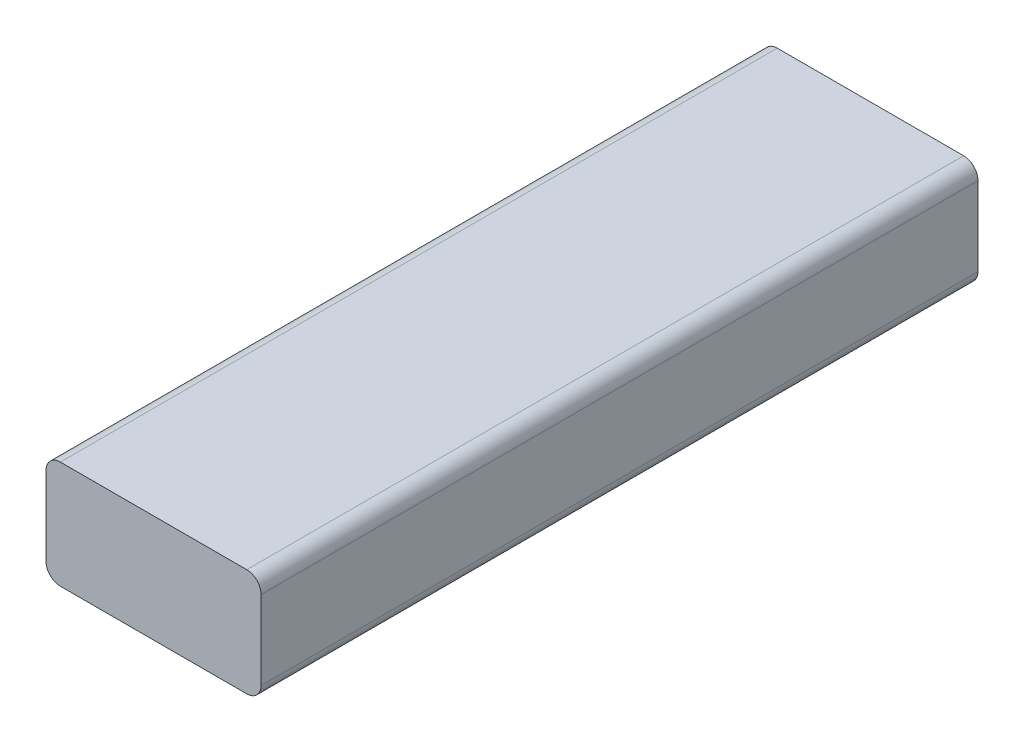
ISO-10303-21;
HEADER;
FILE_DESCRIPTION(('STEP AP214'),'2;1');
FILE_NAME('part.step','',(''),(''),'','','');
FILE_SCHEMA(('AUTOMOTIVE_DESIGN { 1 0 10303 214 1 1 1 1 }'));
ENDSEC;
DATA;
#1=APPLICATION_CONTEXT('core data for automotive mechanical design processes');
#2=APPLICATION_PROTOCOL_DEFINITION('international standard','automotive_design',2000,#1);
#3=PRODUCT_CONTEXT('',#1,'mechanical');
#4=PRODUCT('Part','Part','',(#3));
#5=PRODUCT_RELATED_PRODUCT_CATEGORY('part','',(#4));
#6=PRODUCT_DEFINITION_FORMATION('','',#4);
#7=PRODUCT_DEFINITION_CONTEXT('part definition',#1,'design');
#8=PRODUCT_DEFINITION('design','',#6,#7);
#9=PRODUCT_DEFINITION_SHAPE('','',#8);
#10=(LENGTH_UNIT() NAMED_UNIT(*) SI_UNIT(.MILLI.,.METRE.));
#11=(NAMED_UNIT(*) PLANE_ANGLE_UNIT() SI_UNIT($,.RADIAN.));
#12=(NAMED_UNIT(*) SI_UNIT($,.STERADIAN.) SOLID_ANGLE_UNIT());
#13=UNCERTAINTY_MEASURE_WITH_UNIT(LENGTH_MEASURE(1.E-05),#10,'distance_accuracy_value','');
#14=(GEOMETRIC_REPRESENTATION_CONTEXT(3) GLOBAL_UNCERTAINTY_ASSIGNED_CONTEXT((#13)) GLOBAL_UNIT_ASSIGNED_CONTEXT((#10,
#11,#12)) REPRESENTATION_CONTEXT('',''));
#15=CARTESIAN_POINT('',(0.,0.,0.));
#16=DIRECTION('',(0.,0.,1.));
#17=DIRECTION('',(1.,0.,0.));
#18=AXIS2_PLACEMENT_3D('',#15,#16,#17);
#19=CARTESIAN_POINT('',(0.,0.,254.));
#20=DIRECTION('',(1.,0.,0.));
#21=DIRECTION('',(0.,1.,0.));
#22=AXIS2_PLACEMENT_3D('',#19,#20,#21);
#23=PLANE('',#22);
#24=DIRECTION('',(0.,-1.,0.));
#25=VECTOR('',#24,1.);
#26=CARTESIAN_POINT('',(0.,0.,0.));
#27=LINE('',#26,#25);
#28=CARTESIAN_POINT('',(0.,33.02,0.));
#29=VERTEX_POINT('',#28);
#30=CARTESIAN_POINT('',(0.,5.07999999999999,0.));
#31=VERTEX_POINT('',#30);
#32=EDGE_CURVE('E138',#29,#31,#27,.T.);
#33=ORIENTED_EDGE('',*,*,#32,.T.);
#34=DIRECTION('',(0.,0.,-1.));
#35=VECTOR('',#34,1.);
#36=CARTESIAN_POINT('',(0.,5.08,254.));
#37=LINE('',#36,#35);
#38=CARTESIAN_POINT('',(0.,5.07999999999999,254.));
#39=VERTEX_POINT('',#38);
#40=EDGE_CURVE('E112',#31,#39,#37,.F.);
#41=ORIENTED_EDGE('',*,*,#40,.T.);
#42=DIRECTION('',(0.,-1.,0.));
#43=VECTOR('',#42,1.);
#44=CARTESIAN_POINT('',(0.,0.,254.));
#45=LINE('',#44,#43);
#46=CARTESIAN_POINT('',(0.,33.02,254.));
#47=VERTEX_POINT('',#46);
#48=EDGE_CURVE('E150',#47,#39,#45,.T.);
#49=ORIENTED_EDGE('',*,*,#48,.F.);
#50=DIRECTION('',(0.,0.,-1.));
#51=VECTOR('',#50,1.);
#52=CARTESIAN_POINT('',(0.,33.02,254.));
#53=LINE('',#52,#51);
#54=EDGE_CURVE('E118',#47,#29,#53,.T.);
#55=ORIENTED_EDGE('',*,*,#54,.T.);
#56=EDGE_LOOP('',(#33,#41,#49,#55));
#57=FACE_BOUND('',#56,.T.);
#58=ADVANCED_FACE('F39',(#57),#23,.F.);
#59=CARTESIAN_POINT('',(0.,0.,254.));
#60=DIRECTION('',(0.,1.,0.));
#61=DIRECTION('',(0.,0.,1.));
#62=AXIS2_PLACEMENT_3D('',#59,#60,#61);
#63=PLANE('',#62);
#64=DIRECTION('',(1.,0.,0.));
#65=VECTOR('',#64,1.);
#66=CARTESIAN_POINT('',(0.,0.,254.));
#67=LINE('',#66,#65);
#68=CARTESIAN_POINT('',(5.08,0.,254.));
#69=VERTEX_POINT('',#68);
#70=CARTESIAN_POINT('',(71.12,0.,254.));
#71=VERTEX_POINT('',#70);
#72=EDGE_CURVE('E128',#69,#71,#67,.T.);
#73=ORIENTED_EDGE('',*,*,#72,.F.);
#74=DIRECTION('',(0.,0.,-1.));
#75=VECTOR('',#74,1.);
#76=CARTESIAN_POINT('',(5.08,0.,254.));
#77=LINE('',#76,#75);
#78=CARTESIAN_POINT('',(5.08,0.,0.));
#79=VERTEX_POINT('',#78);
#80=EDGE_CURVE('E111',#69,#79,#77,.T.);
#81=ORIENTED_EDGE('',*,*,#80,.T.);
#82=DIRECTION('',(1.,0.,0.));
#83=VECTOR('',#82,1.);
#84=CARTESIAN_POINT('',(0.,0.,0.));
#85=LINE('',#84,#83);
#86=CARTESIAN_POINT('',(71.12,0.,0.));
#87=VERTEX_POINT('',#86);
#88=EDGE_CURVE('E125',#79,#87,#85,.T.);
#89=ORIENTED_EDGE('',*,*,#88,.T.);
#90=DIRECTION('',(0.,0.,-1.));
#91=VECTOR('',#90,1.);
#92=CARTESIAN_POINT('',(71.12,0.,254.));
#93=LINE('',#92,#91);
#94=EDGE_CURVE('E131',#87,#71,#93,.F.);
#95=ORIENTED_EDGE('',*,*,#94,.T.);
#96=EDGE_LOOP('',(#73,#81,#89,#95));
#97=FACE_BOUND('',#96,.T.);
#98=ADVANCED_FACE('F124',(#97),#63,.F.);
#99=CARTESIAN_POINT('',(76.2,0.,254.));
#100=DIRECTION('',(-1.,0.,0.));
#101=DIRECTION('',(0.,-1.,0.));
#102=AXIS2_PLACEMENT_3D('',#99,#100,#101);
#103=PLANE('',#102);
#104=DIRECTION('',(0.,1.,0.));
#105=VECTOR('',#104,1.);
#106=CARTESIAN_POINT('',(76.2,0.,254.));
#107=LINE('',#106,#105);
#108=CARTESIAN_POINT('',(76.2,5.08,254.));
#109=VERTEX_POINT('',#108);
#110=CARTESIAN_POINT('',(76.2,33.02,254.));
#111=VERTEX_POINT('',#110);
#112=EDGE_CURVE('E186',#109,#111,#107,.T.);
#113=ORIENTED_EDGE('',*,*,#112,.F.);
#114=DIRECTION('',(0.,0.,-1.));
#115=VECTOR('',#114,1.);
#116=CARTESIAN_POINT('',(76.2,5.08,254.));
#117=LINE('',#116,#115);
#118=CARTESIAN_POINT('',(76.2,5.08,0.));
#119=VERTEX_POINT('',#118);
#120=EDGE_CURVE('E11',#109,#119,#117,.T.);
#121=ORIENTED_EDGE('',*,*,#120,.T.);
#122=DIRECTION('',(0.,1.,0.));
#123=VECTOR('',#122,1.);
#124=CARTESIAN_POINT('',(76.2,0.,0.));
#125=LINE('',#124,#123);
#126=CARTESIAN_POINT('',(76.2,33.02,0.));
#127=VERTEX_POINT('',#126);
#128=EDGE_CURVE('E137',#119,#127,#125,.T.);
#129=ORIENTED_EDGE('',*,*,#128,.T.);
#130=DIRECTION('',(0.,0.,-1.));
#131=VECTOR('',#130,1.);
#132=CARTESIAN_POINT('',(76.2,33.02,254.));
#133=LINE('',#132,#131);
#134=EDGE_CURVE('E48',#127,#111,#133,.F.);
#135=ORIENTED_EDGE('',*,*,#134,.T.);
#136=EDGE_LOOP('',(#113,#121,#129,#135));
#137=FACE_BOUND('',#136,.T.);
#138=ADVANCED_FACE('F185',(#137),#103,.F.);
#139=CARTESIAN_POINT('',(0.,38.1,254.));
#140=DIRECTION('',(0.,-1.,0.));
#141=DIRECTION('',(0.,0.,-1.));
#142=AXIS2_PLACEMENT_3D('',#139,#140,#141);
#143=PLANE('',#142);
#144=DIRECTION('',(-1.,0.,0.));
#145=VECTOR('',#144,1.);
#146=CARTESIAN_POINT('',(0.,38.1,0.));
#147=LINE('',#146,#145);
#148=CARTESIAN_POINT('',(71.12,38.1,0.));
#149=VERTEX_POINT('',#148);
#150=CARTESIAN_POINT('',(5.07999999999998,38.1,0.));
#151=VERTEX_POINT('',#150);
#152=EDGE_CURVE('E143',#149,#151,#147,.T.);
#153=ORIENTED_EDGE('',*,*,#152,.T.);
#154=DIRECTION('',(0.,0.,-1.));
#155=VECTOR('',#154,1.);
#156=CARTESIAN_POINT('',(5.07999999999998,38.1,254.));
#157=LINE('',#156,#155);
#158=CARTESIAN_POINT('',(5.07999999999998,38.1,254.));
#159=VERTEX_POINT('',#158);
#160=EDGE_CURVE('E55',#151,#159,#157,.F.);
#161=ORIENTED_EDGE('',*,*,#160,.T.);
#162=DIRECTION('',(-1.,0.,0.));
#163=VECTOR('',#162,1.);
#164=CARTESIAN_POINT('',(0.,38.1,254.));
#165=LINE('',#164,#163);
#166=CARTESIAN_POINT('',(71.12,38.1,254.));
#167=VERTEX_POINT('',#166);
#168=EDGE_CURVE('E152',#167,#159,#165,.T.);
#169=ORIENTED_EDGE('',*,*,#168,.F.);
#170=DIRECTION('',(0.,0.,-1.));
#171=VECTOR('',#170,1.);
#172=CARTESIAN_POINT('',(71.12,38.1,254.));
#173=LINE('',#172,#171);
#174=EDGE_CURVE('E176',#167,#149,#173,.T.);
#175=ORIENTED_EDGE('',*,*,#174,.T.);
#176=EDGE_LOOP('',(#153,#161,#169,#175));
#177=FACE_BOUND('',#176,.T.);
#178=ADVANCED_FACE('F196',(#177),#143,.F.);
#179=CARTESIAN_POINT('',(0.,0.,254.));
#180=DIRECTION('',(0.,0.,-1.));
#181=DIRECTION('',(-1.,0.,0.));
#182=AXIS2_PLACEMENT_3D('',#179,#180,#181);
#183=PLANE('',#182);
#184=ORIENTED_EDGE('',*,*,#48,.T.);
#185=CARTESIAN_POINT('',(5.08,5.08,254.));
#186=DIRECTION('',(0.,0.,-1.));
#187=DIRECTION('',(-1.,0.,0.));
#188=AXIS2_PLACEMENT_3D('',#185,#186,#187);
#189=CIRCLE('',#188,5.08);
#190=EDGE_CURVE('E173',#39,#69,#189,.F.);
#191=ORIENTED_EDGE('',*,*,#190,.T.);
#192=ORIENTED_EDGE('',*,*,#72,.T.);
#193=CARTESIAN_POINT('',(71.12,5.08,254.));
#194=DIRECTION('',(0.,0.,-1.));
#195=DIRECTION('',(-1.,0.,0.));
#196=AXIS2_PLACEMENT_3D('',#193,#194,#195);
#197=CIRCLE('',#196,5.08);
#198=EDGE_CURVE('E167',#71,#109,#197,.F.);
#199=ORIENTED_EDGE('',*,*,#198,.T.);
#200=ORIENTED_EDGE('',*,*,#112,.T.);
#201=CARTESIAN_POINT('',(71.12,33.02,254.));
#202=DIRECTION('',(0.,0.,-1.));
#203=DIRECTION('',(-1.,0.,0.));
#204=AXIS2_PLACEMENT_3D('',#201,#202,#203);
#205=CIRCLE('',#204,5.08);
#206=EDGE_CURVE('E62',#111,#167,#205,.F.);
#207=ORIENTED_EDGE('',*,*,#206,.T.);
#208=ORIENTED_EDGE('',*,*,#168,.T.);
#209=CARTESIAN_POINT('',(5.07999999999998,33.02,254.));
#210=DIRECTION('',(0.,0.,-1.));
#211=DIRECTION('',(-1.,0.,0.));
#212=AXIS2_PLACEMENT_3D('',#209,#210,#211);
#213=CIRCLE('',#212,5.08);
#214=EDGE_CURVE('E170',#159,#47,#213,.F.);
#215=ORIENTED_EDGE('',*,*,#214,.T.);
#216=EDGE_LOOP('',(#184,#191,#192,#199,#200,#207,#208,#215));
#217=FACE_BOUND('',#216,.T.);
#218=ADVANCED_FACE('F190',(#217),#183,.F.);
#219=CARTESIAN_POINT('',(0.,0.,0.));
#220=DIRECTION('',(0.,0.,-1.));
#221=DIRECTION('',(-1.,0.,0.));
#222=AXIS2_PLACEMENT_3D('',#219,#220,#221);
#223=PLANE('',#222);
#224=ORIENTED_EDGE('',*,*,#88,.F.);
#225=CARTESIAN_POINT('',(5.08,5.08,0.));
#226=DIRECTION('',(0.,0.,-1.));
#227=DIRECTION('',(-1.,0.,0.));
#228=AXIS2_PLACEMENT_3D('',#225,#226,#227);
#229=CIRCLE('',#228,5.08);
#230=EDGE_CURVE('E107',#79,#31,#229,.T.);
#231=ORIENTED_EDGE('',*,*,#230,.T.);
#232=ORIENTED_EDGE('',*,*,#32,.F.);
#233=CARTESIAN_POINT('',(5.07999999999998,33.02,0.));
#234=DIRECTION('',(0.,0.,-1.));
#235=DIRECTION('',(-1.,0.,0.));
#236=AXIS2_PLACEMENT_3D('',#233,#234,#235);
#237=CIRCLE('',#236,5.08);
#238=EDGE_CURVE('E119',#29,#151,#237,.T.);
#239=ORIENTED_EDGE('',*,*,#238,.T.);
#240=ORIENTED_EDGE('',*,*,#152,.F.);
#241=CARTESIAN_POINT('',(71.12,33.02,0.));
#242=DIRECTION('',(0.,0.,-1.));
#243=DIRECTION('',(-1.,0.,0.));
#244=AXIS2_PLACEMENT_3D('',#241,#242,#243);
#245=CIRCLE('',#244,5.08);
#246=EDGE_CURVE('E130',#149,#127,#245,.T.);
#247=ORIENTED_EDGE('',*,*,#246,.T.);
#248=ORIENTED_EDGE('',*,*,#128,.F.);
#249=CARTESIAN_POINT('',(71.12,5.08,0.));
#250=DIRECTION('',(0.,0.,-1.));
#251=DIRECTION('',(-1.,0.,0.));
#252=AXIS2_PLACEMENT_3D('',#249,#250,#251);
#253=CIRCLE('',#252,5.08);
#254=EDGE_CURVE('E135',#119,#87,#253,.T.);
#255=ORIENTED_EDGE('',*,*,#254,.T.);
#256=EDGE_LOOP('',(#224,#231,#232,#239,#240,#247,#248,#255));
#257=FACE_BOUND('',#256,.T.);
#258=ADVANCED_FACE('F133',(#257),#223,.T.);
#259=CARTESIAN_POINT('',(5.08,5.08,254.));
#260=DIRECTION('',(0.,0.,-1.));
#261=DIRECTION('',(-1.,0.,0.));
#262=AXIS2_PLACEMENT_3D('',#259,#260,#261);
#263=CYLINDRICAL_SURFACE('',#262,5.08);
#264=ORIENTED_EDGE('',*,*,#190,.F.);
#265=ORIENTED_EDGE('',*,*,#40,.F.);
#266=ORIENTED_EDGE('',*,*,#230,.F.);
#267=ORIENTED_EDGE('',*,*,#80,.F.);
#268=EDGE_LOOP('',(#264,#265,#266,#267));
#269=FACE_BOUND('',#268,.T.);
#270=ADVANCED_FACE('F110',(#269),#263,.T.);
#271=CARTESIAN_POINT('',(5.07999999999998,33.02,254.));
#272=DIRECTION('',(0.,0.,-1.));
#273=DIRECTION('',(-1.,0.,0.));
#274=AXIS2_PLACEMENT_3D('',#271,#272,#273);
#275=CYLINDRICAL_SURFACE('',#274,5.08);
#276=ORIENTED_EDGE('',*,*,#214,.F.);
#277=ORIENTED_EDGE('',*,*,#160,.F.);
#278=ORIENTED_EDGE('',*,*,#238,.F.);
#279=ORIENTED_EDGE('',*,*,#54,.F.);
#280=EDGE_LOOP('',(#276,#277,#278,#279));
#281=FACE_BOUND('',#280,.T.);
#282=ADVANCED_FACE('F200',(#281),#275,.T.);
#283=CARTESIAN_POINT('',(71.12,5.08,254.));
#284=DIRECTION('',(0.,0.,-1.));
#285=DIRECTION('',(-1.,0.,0.));
#286=AXIS2_PLACEMENT_3D('',#283,#284,#285);
#287=CYLINDRICAL_SURFACE('',#286,5.08);
#288=ORIENTED_EDGE('',*,*,#198,.F.);
#289=ORIENTED_EDGE('',*,*,#94,.F.);
#290=ORIENTED_EDGE('',*,*,#254,.F.);
#291=ORIENTED_EDGE('',*,*,#120,.F.);
#292=EDGE_LOOP('',(#288,#289,#290,#291));
#293=FACE_BOUND('',#292,.T.);
#294=ADVANCED_FACE('F209',(#293),#287,.T.);
#295=CARTESIAN_POINT('',(71.12,33.02,254.));
#296=DIRECTION('',(0.,0.,-1.));
#297=DIRECTION('',(-1.,0.,0.));
#298=AXIS2_PLACEMENT_3D('',#295,#296,#297);
#299=CYLINDRICAL_SURFACE('',#298,5.08);
#300=ORIENTED_EDGE('',*,*,#206,.F.);
#301=ORIENTED_EDGE('',*,*,#134,.F.);
#302=ORIENTED_EDGE('',*,*,#246,.F.);
#303=ORIENTED_EDGE('',*,*,#174,.F.);
#304=EDGE_LOOP('',(#300,#301,#302,#303));
#305=FACE_BOUND('',#304,.T.);
#306=ADVANCED_FACE('F41',(#305),#299,.T.);
#307=CLOSED_SHELL('',(#58,#98,#138,#178,#218,#258,#270,#282,#294,#306));
#308=MANIFOLD_SOLID_BREP('B2',#307);
#309=ADVANCED_BREP_SHAPE_REPRESENTATION('',(#18,#308),#14);
#310=SHAPE_DEFINITION_REPRESENTATION(#9,#309);
ENDSEC;
END-ISO-10303-21;
